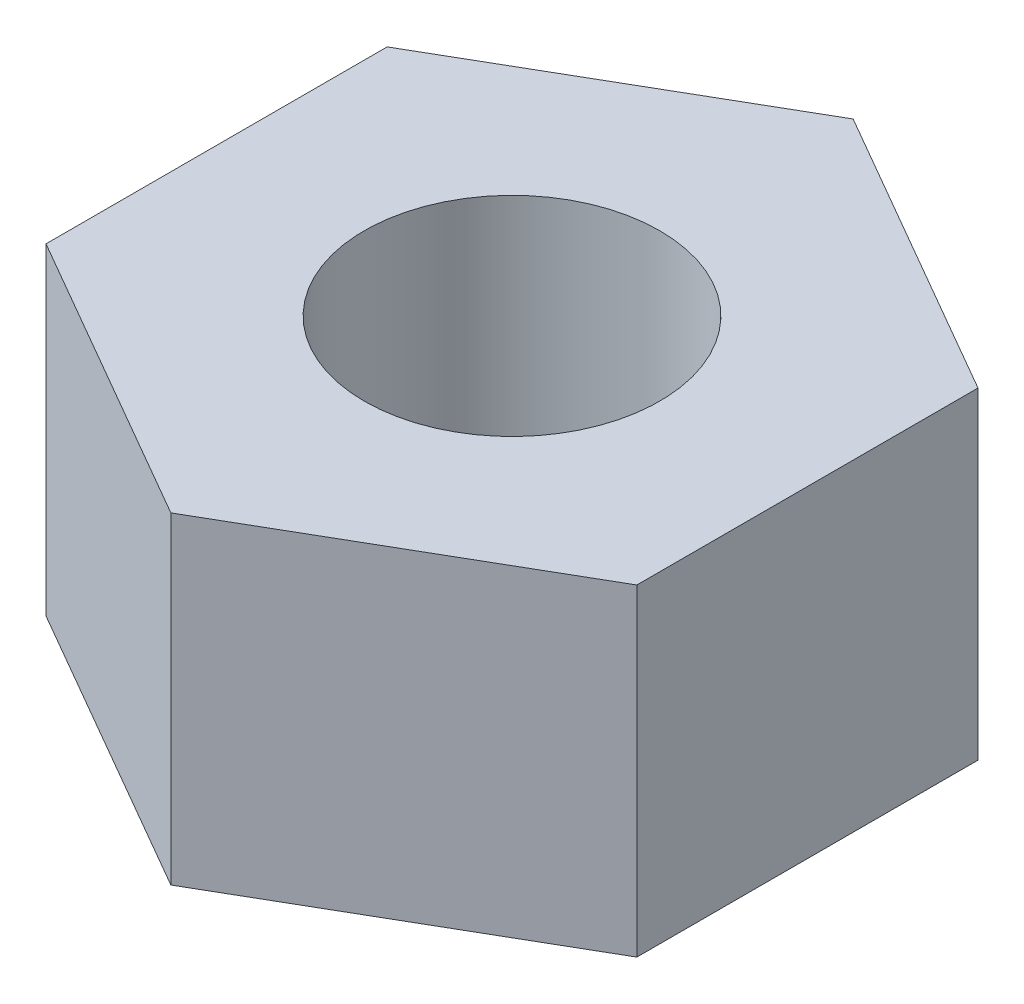
ISO-10303-21;
HEADER;
FILE_DESCRIPTION(('STEP AP214'),'2;1');
FILE_NAME('part.step','',(''),(''),'','','');
FILE_SCHEMA(('AUTOMOTIVE_DESIGN { 1 0 10303 214 1 1 1 1 }'));
ENDSEC;
DATA;
#1=APPLICATION_CONTEXT('core data for automotive mechanical design processes');
#2=APPLICATION_PROTOCOL_DEFINITION('international standard','automotive_design',2000,#1);
#3=PRODUCT_CONTEXT('',#1,'mechanical');
#4=PRODUCT('Part','Part','',(#3));
#5=PRODUCT_RELATED_PRODUCT_CATEGORY('part','',(#4));
#6=PRODUCT_DEFINITION_FORMATION('','',#4);
#7=PRODUCT_DEFINITION_CONTEXT('part definition',#1,'design');
#8=PRODUCT_DEFINITION('design','',#6,#7);
#9=PRODUCT_DEFINITION_SHAPE('','',#8);
#10=(LENGTH_UNIT() NAMED_UNIT(*) SI_UNIT(.MILLI.,.METRE.));
#11=(NAMED_UNIT(*) PLANE_ANGLE_UNIT() SI_UNIT($,.RADIAN.));
#12=(NAMED_UNIT(*) SI_UNIT($,.STERADIAN.) SOLID_ANGLE_UNIT());
#13=UNCERTAINTY_MEASURE_WITH_UNIT(LENGTH_MEASURE(1.E-05),#10,'distance_accuracy_value','');
#14=(GEOMETRIC_REPRESENTATION_CONTEXT(3) GLOBAL_UNCERTAINTY_ASSIGNED_CONTEXT((#13)) GLOBAL_UNIT_ASSIGNED_CONTEXT((#10,
#11,#12)) REPRESENTATION_CONTEXT('',''));
#15=CARTESIAN_POINT('',(0.,0.,0.));
#16=DIRECTION('',(0.,0.,1.));
#17=DIRECTION('',(1.,0.,0.));
#18=AXIS2_PLACEMENT_3D('',#15,#16,#17);
#19=CARTESIAN_POINT('',(0.,3.,0.));
#20=DIRECTION('',(0.,1.,0.));
#21=DIRECTION('',(0.,0.,1.));
#22=AXIS2_PLACEMENT_3D('',#19,#20,#21);
#23=PLANE('',#22);
#24=DIRECTION('',(-0.866025403784439,0.,-0.5));
#25=VECTOR('',#24,1.);
#26=CARTESIAN_POINT('',(2.75,3.,-1.58771324027147));
#27=LINE('',#26,#25);
#28=CARTESIAN_POINT('',(2.75,3.,-1.58771324027147));
#29=VERTEX_POINT('',#28);
#30=CARTESIAN_POINT('',(0.,3.,-3.17542648054294));
#31=VERTEX_POINT('',#30);
#32=EDGE_CURVE('E146',#29,#31,#27,.T.);
#33=ORIENTED_EDGE('',*,*,#32,.T.);
#34=DIRECTION('',(-0.866025403784439,0.,0.5));
#35=VECTOR('',#34,1.);
#36=CARTESIAN_POINT('',(0.,3.,-3.17542648054294));
#37=LINE('',#36,#35);
#38=CARTESIAN_POINT('',(-2.75,3.,-1.58771324027147));
#39=VERTEX_POINT('',#38);
#40=EDGE_CURVE('E94',#31,#39,#37,.T.);
#41=ORIENTED_EDGE('',*,*,#40,.T.);
#42=DIRECTION('',(0.,0.,1.));
#43=VECTOR('',#42,1.);
#44=CARTESIAN_POINT('',(-2.75,3.,-1.58771324027147));
#45=LINE('',#44,#43);
#46=CARTESIAN_POINT('',(-2.75,3.,1.58771324027147));
#47=VERTEX_POINT('',#46);
#48=EDGE_CURVE('E107',#39,#47,#45,.T.);
#49=ORIENTED_EDGE('',*,*,#48,.T.);
#50=DIRECTION('',(0.866025403784439,0.,0.5));
#51=VECTOR('',#50,1.);
#52=CARTESIAN_POINT('',(-2.75,3.,1.58771324027147));
#53=LINE('',#52,#51);
#54=CARTESIAN_POINT('',(0.,3.,3.17542648054294));
#55=VERTEX_POINT('',#54);
#56=EDGE_CURVE('E101',#47,#55,#53,.T.);
#57=ORIENTED_EDGE('',*,*,#56,.T.);
#58=DIRECTION('',(0.866025403784439,0.,-0.5));
#59=VECTOR('',#58,1.);
#60=CARTESIAN_POINT('',(0.,3.,3.17542648054294));
#61=LINE('',#60,#59);
#62=CARTESIAN_POINT('',(2.75,3.,1.58771324027147));
#63=VERTEX_POINT('',#62);
#64=EDGE_CURVE('E105',#55,#63,#61,.T.);
#65=ORIENTED_EDGE('',*,*,#64,.T.);
#66=DIRECTION('',(0.,0.,-1.));
#67=VECTOR('',#66,1.);
#68=CARTESIAN_POINT('',(2.75,3.,1.58771324027147));
#69=LINE('',#68,#67);
#70=EDGE_CURVE('E57',#63,#29,#69,.T.);
#71=ORIENTED_EDGE('',*,*,#70,.T.);
#72=EDGE_LOOP('',(#33,#41,#49,#57,#65,#71));
#73=FACE_BOUND('',#72,.T.);
#74=CARTESIAN_POINT('',(0.,3.,0.));
#75=DIRECTION('',(0.,1.,0.));
#76=DIRECTION('',(0.,0.,1.));
#77=AXIS2_PLACEMENT_3D('',#74,#75,#76);
#78=CIRCLE('',#77,1.375);
#79=CARTESIAN_POINT('',(0.,3.,1.375));
#80=VERTEX_POINT('',#79);
#81=EDGE_CURVE('E134',#80,#80,#78,.T.);
#82=ORIENTED_EDGE('',*,*,#81,.F.);
#83=EDGE_LOOP('',(#82));
#84=FACE_BOUND('',#83,.T.);
#85=ADVANCED_FACE('F39',(#73,#84),#23,.T.);
#86=CARTESIAN_POINT('',(0.,0.,0.));
#87=DIRECTION('',(0.,1.,0.));
#88=DIRECTION('',(0.,0.,1.));
#89=AXIS2_PLACEMENT_3D('',#86,#87,#88);
#90=PLANE('',#89);
#91=DIRECTION('',(-0.866025403784439,0.,-0.5));
#92=VECTOR('',#91,1.);
#93=CARTESIAN_POINT('',(2.75,0.,-1.58771324027147));
#94=LINE('',#93,#92);
#95=CARTESIAN_POINT('',(2.75,0.,-1.58771324027147));
#96=VERTEX_POINT('',#95);
#97=CARTESIAN_POINT('',(0.,0.,-3.17542648054294));
#98=VERTEX_POINT('',#97);
#99=EDGE_CURVE('E129',#96,#98,#94,.T.);
#100=ORIENTED_EDGE('',*,*,#99,.F.);
#101=DIRECTION('',(0.,0.,-1.));
#102=VECTOR('',#101,1.);
#103=CARTESIAN_POINT('',(2.75,0.,1.58771324027147));
#104=LINE('',#103,#102);
#105=CARTESIAN_POINT('',(2.75,0.,1.58771324027147));
#106=VERTEX_POINT('',#105);
#107=EDGE_CURVE('E86',#106,#96,#104,.T.);
#108=ORIENTED_EDGE('',*,*,#107,.F.);
#109=DIRECTION('',(0.866025403784439,0.,-0.5));
#110=VECTOR('',#109,1.);
#111=CARTESIAN_POINT('',(0.,0.,3.17542648054294));
#112=LINE('',#111,#110);
#113=CARTESIAN_POINT('',(0.,0.,3.17542648054294));
#114=VERTEX_POINT('',#113);
#115=EDGE_CURVE('E80',#114,#106,#112,.T.);
#116=ORIENTED_EDGE('',*,*,#115,.F.);
#117=DIRECTION('',(0.866025403784439,0.,0.5));
#118=VECTOR('',#117,1.);
#119=CARTESIAN_POINT('',(-2.75,0.,1.58771324027147));
#120=LINE('',#119,#118);
#121=CARTESIAN_POINT('',(-2.75,0.,1.58771324027147));
#122=VERTEX_POINT('',#121);
#123=EDGE_CURVE('E116',#122,#114,#120,.T.);
#124=ORIENTED_EDGE('',*,*,#123,.F.);
#125=DIRECTION('',(0.,0.,1.));
#126=VECTOR('',#125,1.);
#127=CARTESIAN_POINT('',(-2.75,0.,-1.58771324027147));
#128=LINE('',#127,#126);
#129=CARTESIAN_POINT('',(-2.75,0.,-1.58771324027147));
#130=VERTEX_POINT('',#129);
#131=EDGE_CURVE('E137',#130,#122,#128,.T.);
#132=ORIENTED_EDGE('',*,*,#131,.F.);
#133=DIRECTION('',(-0.866025403784439,0.,0.5));
#134=VECTOR('',#133,1.);
#135=CARTESIAN_POINT('',(0.,0.,-3.17542648054294));
#136=LINE('',#135,#134);
#137=EDGE_CURVE('E133',#98,#130,#136,.T.);
#138=ORIENTED_EDGE('',*,*,#137,.F.);
#139=EDGE_LOOP('',(#100,#108,#116,#124,#132,#138));
#140=FACE_BOUND('',#139,.T.);
#141=CARTESIAN_POINT('',(0.,0.,0.));
#142=DIRECTION('',(0.,1.,0.));
#143=DIRECTION('',(0.,0.,1.));
#144=AXIS2_PLACEMENT_3D('',#141,#142,#143);
#145=CIRCLE('',#144,1.375);
#146=CARTESIAN_POINT('',(0.,0.,1.375));
#147=VERTEX_POINT('',#146);
#148=EDGE_CURVE('E243',#147,#147,#145,.T.);
#149=ORIENTED_EDGE('',*,*,#148,.T.);
#150=EDGE_LOOP('',(#149));
#151=FACE_BOUND('',#150,.T.);
#152=ADVANCED_FACE('F159',(#140,#151),#90,.F.);
#153=CARTESIAN_POINT('',(2.75,3.,-1.58771324027147));
#154=DIRECTION('',(-0.5,0.,0.866025403784439));
#155=DIRECTION('',(0.866025403784439,0.,0.5));
#156=AXIS2_PLACEMENT_3D('',#153,#154,#155);
#157=PLANE('',#156);
#158=ORIENTED_EDGE('',*,*,#99,.T.);
#159=DIRECTION('',(0.,-1.,0.));
#160=VECTOR('',#159,1.);
#161=CARTESIAN_POINT('',(0.,3.,-3.17542648054294));
#162=LINE('',#161,#160);
#163=EDGE_CURVE('E11',#31,#98,#162,.T.);
#164=ORIENTED_EDGE('',*,*,#163,.F.);
#165=ORIENTED_EDGE('',*,*,#32,.F.);
#166=DIRECTION('',(0.,-1.,0.));
#167=VECTOR('',#166,1.);
#168=CARTESIAN_POINT('',(2.75,3.,-1.58771324027147));
#169=LINE('',#168,#167);
#170=EDGE_CURVE('E125',#29,#96,#169,.T.);
#171=ORIENTED_EDGE('',*,*,#170,.T.);
#172=EDGE_LOOP('',(#158,#164,#165,#171));
#173=FACE_BOUND('',#172,.T.);
#174=ADVANCED_FACE('F41',(#173),#157,.F.);
#175=CARTESIAN_POINT('',(0.,3.,-3.17542648054294));
#176=DIRECTION('',(0.5,0.,0.866025403784439));
#177=DIRECTION('',(0.866025403784439,0.,-0.5));
#178=AXIS2_PLACEMENT_3D('',#175,#176,#177);
#179=PLANE('',#178);
#180=ORIENTED_EDGE('',*,*,#137,.T.);
#181=DIRECTION('',(0.,-1.,0.));
#182=VECTOR('',#181,1.);
#183=CARTESIAN_POINT('',(-2.75,3.,-1.58771324027147));
#184=LINE('',#183,#182);
#185=EDGE_CURVE('E49',#39,#130,#184,.T.);
#186=ORIENTED_EDGE('',*,*,#185,.F.);
#187=ORIENTED_EDGE('',*,*,#40,.F.);
#188=ORIENTED_EDGE('',*,*,#163,.T.);
#189=EDGE_LOOP('',(#180,#186,#187,#188));
#190=FACE_BOUND('',#189,.T.);
#191=ADVANCED_FACE('F184',(#190),#179,.F.);
#192=CARTESIAN_POINT('',(-2.75,3.,-1.58771324027147));
#193=DIRECTION('',(1.,0.,0.));
#194=DIRECTION('',(0.,0.,-1.));
#195=AXIS2_PLACEMENT_3D('',#192,#193,#194);
#196=PLANE('',#195);
#197=ORIENTED_EDGE('',*,*,#131,.T.);
#198=DIRECTION('',(0.,-1.,0.));
#199=VECTOR('',#198,1.);
#200=CARTESIAN_POINT('',(-2.75,3.,1.58771324027147));
#201=LINE('',#200,#199);
#202=EDGE_CURVE('E118',#47,#122,#201,.T.);
#203=ORIENTED_EDGE('',*,*,#202,.F.);
#204=ORIENTED_EDGE('',*,*,#48,.F.);
#205=ORIENTED_EDGE('',*,*,#185,.T.);
#206=EDGE_LOOP('',(#197,#203,#204,#205));
#207=FACE_BOUND('',#206,.T.);
#208=ADVANCED_FACE('F156',(#207),#196,.F.);
#209=CARTESIAN_POINT('',(-2.75,3.,1.58771324027147));
#210=DIRECTION('',(0.5,0.,-0.866025403784439));
#211=DIRECTION('',(-0.866025403784439,0.,-0.5));
#212=AXIS2_PLACEMENT_3D('',#209,#210,#211);
#213=PLANE('',#212);
#214=ORIENTED_EDGE('',*,*,#123,.T.);
#215=DIRECTION('',(0.,-1.,0.));
#216=VECTOR('',#215,1.);
#217=CARTESIAN_POINT('',(0.,3.,3.17542648054294));
#218=LINE('',#217,#216);
#219=EDGE_CURVE('E113',#55,#114,#218,.T.);
#220=ORIENTED_EDGE('',*,*,#219,.F.);
#221=ORIENTED_EDGE('',*,*,#56,.F.);
#222=ORIENTED_EDGE('',*,*,#202,.T.);
#223=EDGE_LOOP('',(#214,#220,#221,#222));
#224=FACE_BOUND('',#223,.T.);
#225=ADVANCED_FACE('F114',(#224),#213,.F.);
#226=CARTESIAN_POINT('',(0.,3.,3.17542648054294));
#227=DIRECTION('',(-0.5,0.,-0.866025403784439));
#228=DIRECTION('',(-0.866025403784439,0.,0.5));
#229=AXIS2_PLACEMENT_3D('',#226,#227,#228);
#230=PLANE('',#229);
#231=ORIENTED_EDGE('',*,*,#115,.T.);
#232=DIRECTION('',(0.,-1.,0.));
#233=VECTOR('',#232,1.);
#234=CARTESIAN_POINT('',(2.75,3.,1.58771324027147));
#235=LINE('',#234,#233);
#236=EDGE_CURVE('E119',#63,#106,#235,.T.);
#237=ORIENTED_EDGE('',*,*,#236,.F.);
#238=ORIENTED_EDGE('',*,*,#64,.F.);
#239=ORIENTED_EDGE('',*,*,#219,.T.);
#240=EDGE_LOOP('',(#231,#237,#238,#239));
#241=FACE_BOUND('',#240,.T.);
#242=ADVANCED_FACE('F121',(#241),#230,.F.);
#243=CARTESIAN_POINT('',(2.75,3.,1.58771324027147));
#244=DIRECTION('',(-1.,0.,0.));
#245=DIRECTION('',(0.,0.,1.));
#246=AXIS2_PLACEMENT_3D('',#243,#244,#245);
#247=PLANE('',#246);
#248=ORIENTED_EDGE('',*,*,#107,.T.);
#249=ORIENTED_EDGE('',*,*,#170,.F.);
#250=ORIENTED_EDGE('',*,*,#70,.F.);
#251=ORIENTED_EDGE('',*,*,#236,.T.);
#252=EDGE_LOOP('',(#248,#249,#250,#251));
#253=FACE_BOUND('',#252,.T.);
#254=ADVANCED_FACE('F164',(#253),#247,.F.);
#255=CARTESIAN_POINT('',(0.,3.,0.));
#256=DIRECTION('',(0.,-1.,0.));
#257=DIRECTION('',(0.,0.,-1.));
#258=AXIS2_PLACEMENT_3D('',#255,#256,#257);
#259=CYLINDRICAL_SURFACE('',#258,1.375);
#260=ORIENTED_EDGE('',*,*,#81,.T.);
#261=EDGE_LOOP('',(#260));
#262=FACE_BOUND('',#261,.T.);
#263=ORIENTED_EDGE('',*,*,#148,.F.);
#264=EDGE_LOOP('',(#263));
#265=FACE_BOUND('',#264,.T.);
#266=ADVANCED_FACE('F166',(#262,#265),#259,.F.);
#267=CLOSED_SHELL('',(#85,#152,#174,#191,#208,#225,#242,#254,#266));
#268=MANIFOLD_SOLID_BREP('B2',#267);
#269=ADVANCED_BREP_SHAPE_REPRESENTATION('',(#18,#268),#14);
#270=SHAPE_DEFINITION_REPRESENTATION(#9,#269);
ENDSEC;
END-ISO-10303-21;
